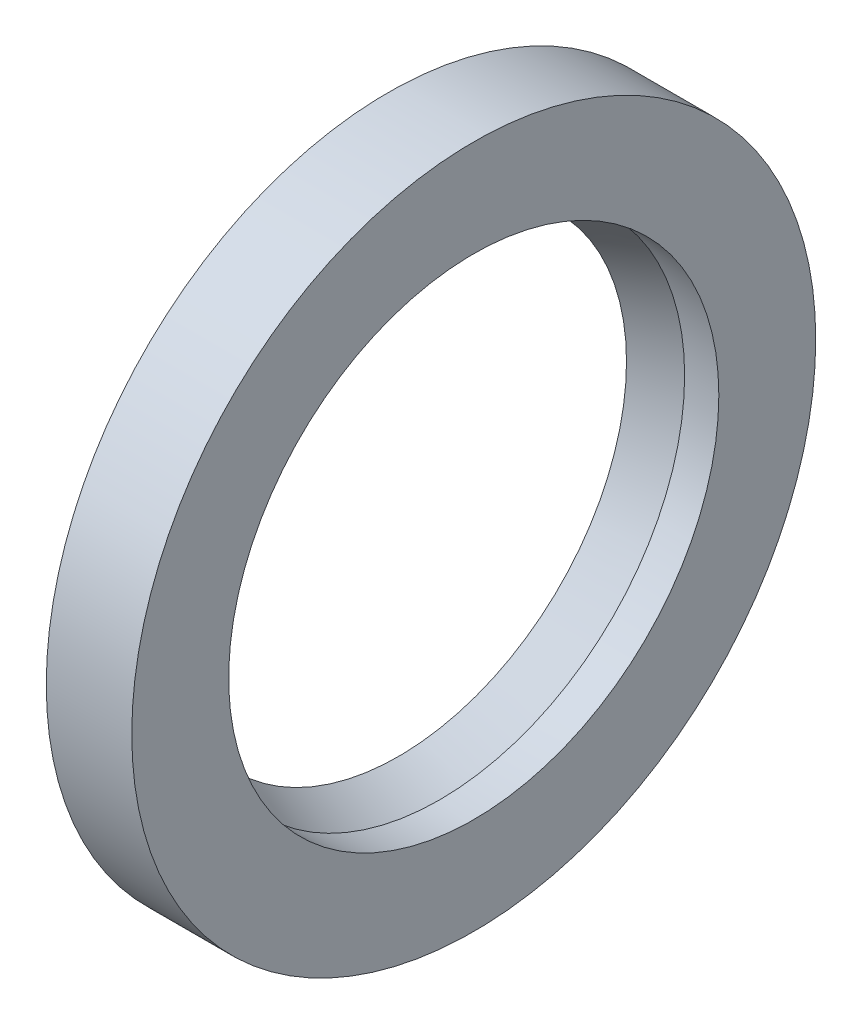
ISO-10303-21;
HEADER;
FILE_DESCRIPTION(('STEP AP214'),'2;1');
FILE_NAME('part.step','',(''),(''),'','','');
FILE_SCHEMA(('AUTOMOTIVE_DESIGN { 1 0 10303 214 1 1 1 1 }'));
ENDSEC;
DATA;
#1=APPLICATION_CONTEXT('core data for automotive mechanical design processes');
#2=APPLICATION_PROTOCOL_DEFINITION('international standard','automotive_design',2000,#1);
#3=PRODUCT_CONTEXT('',#1,'mechanical');
#4=PRODUCT('Part','Part','',(#3));
#5=PRODUCT_RELATED_PRODUCT_CATEGORY('part','',(#4));
#6=PRODUCT_DEFINITION_FORMATION('','',#4);
#7=PRODUCT_DEFINITION_CONTEXT('part definition',#1,'design');
#8=PRODUCT_DEFINITION('design','',#6,#7);
#9=PRODUCT_DEFINITION_SHAPE('','',#8);
#10=(LENGTH_UNIT() NAMED_UNIT(*) SI_UNIT(.MILLI.,.METRE.));
#11=(NAMED_UNIT(*) PLANE_ANGLE_UNIT() SI_UNIT($,.RADIAN.));
#12=(NAMED_UNIT(*) SI_UNIT($,.STERADIAN.) SOLID_ANGLE_UNIT());
#13=UNCERTAINTY_MEASURE_WITH_UNIT(LENGTH_MEASURE(1.E-05),#10,'distance_accuracy_value','');
#14=(GEOMETRIC_REPRESENTATION_CONTEXT(3) GLOBAL_UNCERTAINTY_ASSIGNED_CONTEXT((#13)) GLOBAL_UNIT_ASSIGNED_CONTEXT((#10,
#11,#12)) REPRESENTATION_CONTEXT('',''));
#15=CARTESIAN_POINT('',(0.,0.,0.));
#16=DIRECTION('',(0.,0.,1.));
#17=DIRECTION('',(1.,0.,0.));
#18=AXIS2_PLACEMENT_3D('',#15,#16,#17);
#19=CARTESIAN_POINT('',(1.6263,0.,0.));
#20=DIRECTION('',(1.,0.,0.));
#21=DIRECTION('',(0.,0.,-1.));
#22=AXIS2_PLACEMENT_3D('',#19,#20,#21);
#23=CONICAL_SURFACE('',#22,9.81725,0.676764880616652);
#24=CARTESIAN_POINT('',(1.6263,0.,0.));
#25=DIRECTION('',(1.,0.,0.));
#26=DIRECTION('',(0.,1.,0.));
#27=AXIS2_PLACEMENT_3D('',#24,#25,#26);
#28=CIRCLE('',#27,9.81725);
#29=CARTESIAN_POINT('',(1.6263,9.81725,0.));
#30=VERTEX_POINT('',#29);
#31=EDGE_CURVE('E28',#30,#30,#28,.T.);
#32=ORIENTED_EDGE('',*,*,#31,.F.);
#33=EDGE_LOOP('',(#32));
#34=FACE_BOUND('',#33,.T.);
#35=CARTESIAN_POINT('',(0.360000000000001,0.,0.));
#36=DIRECTION('',(1.,0.,0.));
#37=DIRECTION('',(0.,0.,-1.));
#38=AXIS2_PLACEMENT_3D('',#35,#36,#37);
#39=CIRCLE('',#38,8.8);
#40=CARTESIAN_POINT('',(0.360000000000001,0.,-8.8));
#41=VERTEX_POINT('',#40);
#42=EDGE_CURVE('E16',#41,#41,#39,.F.);
#43=ORIENTED_EDGE('',*,*,#42,.F.);
#44=EDGE_LOOP('',(#43));
#45=FACE_BOUND('',#44,.T.);
#46=ADVANCED_FACE('F13',(#34,#45),#23,.T.);
#47=CARTESIAN_POINT('',(1.6263,0.,0.));
#48=DIRECTION('',(1.,0.,0.));
#49=DIRECTION('',(0.,1.,0.));
#50=AXIS2_PLACEMENT_3D('',#47,#48,#49);
#51=TOROIDAL_SURFACE('',#50,10.00925,0.192000000000001);
#52=CARTESIAN_POINT('',(1.6263,0.,0.));
#53=DIRECTION('',(-1.,0.,0.));
#54=DIRECTION('',(0.,0.,1.));
#55=AXIS2_PLACEMENT_3D('',#52,#53,#54);
#56=CIRCLE('',#55,10.20125);
#57=CARTESIAN_POINT('',(1.62629999999999,0.,10.20125));
#58=VERTEX_POINT('',#57);
#59=EDGE_CURVE('E38',#58,#58,#56,.F.);
#60=ORIENTED_EDGE('',*,*,#59,.F.);
#61=EDGE_LOOP('',(#60));
#62=FACE_BOUND('',#61,.T.);
#63=ORIENTED_EDGE('',*,*,#31,.T.);
#64=EDGE_LOOP('',(#63));
#65=FACE_BOUND('',#64,.T.);
#66=ADVANCED_FACE('F48',(#62,#65),#51,.F.);
#67=CARTESIAN_POINT('',(0.36,0.,8.4));
#68=DIRECTION('',(-1.,0.,0.));
#69=DIRECTION('',(0.,0.,1.));
#70=AXIS2_PLACEMENT_3D('',#67,#68,#69);
#71=PLANE('',#70);
#72=CARTESIAN_POINT('',(0.359999999999999,0.,0.));
#73=DIRECTION('',(1.,0.,0.));
#74=DIRECTION('',(0.,0.,-1.));
#75=AXIS2_PLACEMENT_3D('',#72,#73,#74);
#76=CIRCLE('',#75,8.);
#77=CARTESIAN_POINT('',(0.359999999999999,0.,-8.));
#78=VERTEX_POINT('',#77);
#79=EDGE_CURVE('E36',#78,#78,#76,.F.);
#80=ORIENTED_EDGE('',*,*,#79,.F.);
#81=EDGE_LOOP('',(#80));
#82=FACE_BOUND('',#81,.T.);
#83=ORIENTED_EDGE('',*,*,#42,.T.);
#84=EDGE_LOOP('',(#83));
#85=FACE_BOUND('',#84,.T.);
#86=ADVANCED_FACE('F51',(#82,#85),#71,.T.);
#87=CARTESIAN_POINT('',(1.62629999999999,0.,0.));
#88=DIRECTION('',(-1.,0.,0.));
#89=DIRECTION('',(0.,-1.,0.));
#90=AXIS2_PLACEMENT_3D('',#87,#88,#89);
#91=CONICAL_SURFACE('',#90,10.20125,0.164969189853548);
#92=CARTESIAN_POINT('',(0.,0.,0.));
#93=DIRECTION('',(-1.,0.,0.));
#94=DIRECTION('',(0.,-1.,0.));
#95=AXIS2_PLACEMENT_3D('',#92,#93,#94);
#96=CIRCLE('',#95,10.472);
#97=CARTESIAN_POINT('',(0.,-10.472,0.));
#98=VERTEX_POINT('',#97);
#99=EDGE_CURVE('E34',#98,#98,#96,.F.);
#100=ORIENTED_EDGE('',*,*,#99,.F.);
#101=EDGE_LOOP('',(#100));
#102=FACE_BOUND('',#101,.T.);
#103=ORIENTED_EDGE('',*,*,#59,.T.);
#104=EDGE_LOOP('',(#103));
#105=FACE_BOUND('',#104,.T.);
#106=ADVANCED_FACE('F55',(#102,#105),#91,.F.);
#107=CARTESIAN_POINT('',(0.36,0.,0.));
#108=DIRECTION('',(1.,0.,0.));
#109=DIRECTION('',(0.,0.,-1.));
#110=AXIS2_PLACEMENT_3D('',#107,#108,#109);
#111=CONICAL_SURFACE('',#110,8.,0.394791119699761);
#112=ORIENTED_EDGE('',*,*,#79,.T.);
#113=EDGE_LOOP('',(#112));
#114=FACE_BOUND('',#113,.T.);
#115=CARTESIAN_POINT('',(1.8,0.,0.));
#116=DIRECTION('',(-1.,0.,0.));
#117=DIRECTION('',(0.,0.,1.));
#118=AXIS2_PLACEMENT_3D('',#115,#116,#117);
#119=CIRCLE('',#118,8.6);
#120=CARTESIAN_POINT('',(1.8,0.,8.6));
#121=VERTEX_POINT('',#120);
#122=EDGE_CURVE('E33',#121,#121,#119,.T.);
#123=ORIENTED_EDGE('',*,*,#122,.F.);
#124=EDGE_LOOP('',(#123));
#125=FACE_BOUND('',#124,.T.);
#126=ADVANCED_FACE('F59',(#114,#125),#111,.F.);
#127=CARTESIAN_POINT('',(0.,0.,11.236));
#128=DIRECTION('',(-1.,0.,0.));
#129=DIRECTION('',(0.,0.,1.));
#130=AXIS2_PLACEMENT_3D('',#127,#128,#129);
#131=PLANE('',#130);
#132=ORIENTED_EDGE('',*,*,#99,.T.);
#133=EDGE_LOOP('',(#132));
#134=FACE_BOUND('',#133,.T.);
#135=CARTESIAN_POINT('',(0.,0.,0.));
#136=DIRECTION('',(1.,0.,0.));
#137=DIRECTION('',(0.,0.,-1.));
#138=AXIS2_PLACEMENT_3D('',#135,#136,#137);
#139=CIRCLE('',#138,12.);
#140=CARTESIAN_POINT('',(0.,0.,-12.));
#141=VERTEX_POINT('',#140);
#142=EDGE_CURVE('E25',#141,#141,#139,.T.);
#143=ORIENTED_EDGE('',*,*,#142,.F.);
#144=EDGE_LOOP('',(#143));
#145=FACE_BOUND('',#144,.T.);
#146=ADVANCED_FACE('F63',(#134,#145),#131,.T.);
#147=CARTESIAN_POINT('',(1.8,0.,0.));
#148=DIRECTION('',(1.,0.,0.));
#149=DIRECTION('',(0.,0.,-1.));
#150=AXIS2_PLACEMENT_3D('',#147,#148,#149);
#151=CYLINDRICAL_SURFACE('',#150,8.6);
#152=ORIENTED_EDGE('',*,*,#122,.T.);
#153=EDGE_LOOP('',(#152));
#154=FACE_BOUND('',#153,.T.);
#155=CARTESIAN_POINT('',(3.,0.,0.));
#156=DIRECTION('',(1.,0.,0.));
#157=DIRECTION('',(0.,0.,-1.));
#158=AXIS2_PLACEMENT_3D('',#155,#156,#157);
#159=CIRCLE('',#158,8.6);
#160=CARTESIAN_POINT('',(3.,0.,-8.6));
#161=VERTEX_POINT('',#160);
#162=EDGE_CURVE('E20',#161,#161,#159,.F.);
#163=ORIENTED_EDGE('',*,*,#162,.F.);
#164=EDGE_LOOP('',(#163));
#165=FACE_BOUND('',#164,.T.);
#166=ADVANCED_FACE('F66',(#154,#165),#151,.F.);
#167=CARTESIAN_POINT('',(1.5,0.,0.));
#168=DIRECTION('',(1.,0.,0.));
#169=DIRECTION('',(0.,0.,-1.));
#170=AXIS2_PLACEMENT_3D('',#167,#168,#169);
#171=CYLINDRICAL_SURFACE('',#170,12.);
#172=CARTESIAN_POINT('',(3.,0.,0.));
#173=DIRECTION('',(1.,0.,0.));
#174=DIRECTION('',(0.,0.,-1.));
#175=AXIS2_PLACEMENT_3D('',#172,#173,#174);
#176=CIRCLE('',#175,12.);
#177=CARTESIAN_POINT('',(3.,0.,-12.));
#178=VERTEX_POINT('',#177);
#179=EDGE_CURVE('E9',#178,#178,#176,.T.);
#180=ORIENTED_EDGE('',*,*,#179,.F.);
#181=EDGE_LOOP('',(#180));
#182=FACE_BOUND('',#181,.T.);
#183=ORIENTED_EDGE('',*,*,#142,.T.);
#184=EDGE_LOOP('',(#183));
#185=FACE_BOUND('',#184,.T.);
#186=ADVANCED_FACE('F70',(#182,#185),#171,.T.);
#187=CARTESIAN_POINT('',(3.,0.,10.3));
#188=DIRECTION('',(1.,0.,0.));
#189=DIRECTION('',(0.,0.,-1.));
#190=AXIS2_PLACEMENT_3D('',#187,#188,#189);
#191=PLANE('',#190);
#192=ORIENTED_EDGE('',*,*,#179,.T.);
#193=EDGE_LOOP('',(#192));
#194=FACE_BOUND('',#193,.T.);
#195=ORIENTED_EDGE('',*,*,#162,.T.);
#196=EDGE_LOOP('',(#195));
#197=FACE_BOUND('',#196,.T.);
#198=ADVANCED_FACE('F74',(#194,#197),#191,.T.);
#199=CLOSED_SHELL('',(#46,#66,#86,#106,#126,#146,#166,#186,#198));
#200=MANIFOLD_SOLID_BREP('B1',#199);
#201=ADVANCED_BREP_SHAPE_REPRESENTATION('',(#18,#200),#14);
#202=SHAPE_DEFINITION_REPRESENTATION(#9,#201);
ENDSEC;
END-ISO-10303-21;
